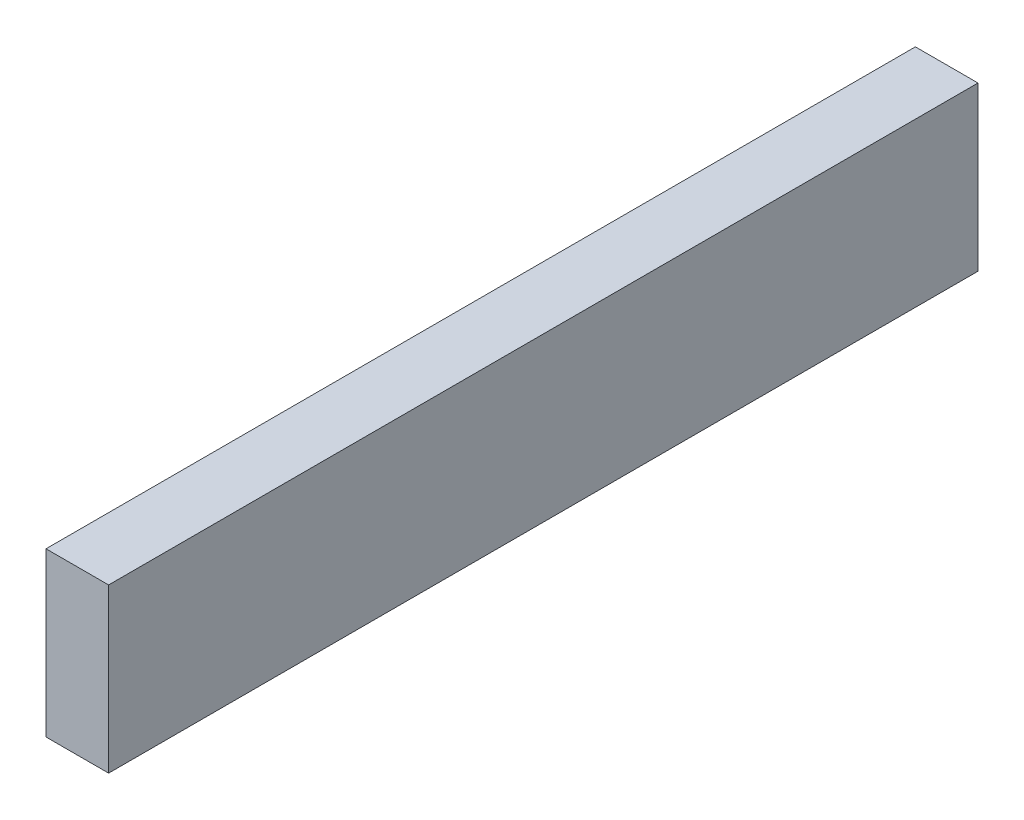
ISO-10303-21;
HEADER;
FILE_DESCRIPTION(('STEP AP214'),'2;1');
FILE_NAME('part.step','',(''),(''),'','','');
FILE_SCHEMA(('AUTOMOTIVE_DESIGN { 1 0 10303 214 1 1 1 1 }'));
ENDSEC;
DATA;
#1=APPLICATION_CONTEXT('core data for automotive mechanical design processes');
#2=APPLICATION_PROTOCOL_DEFINITION('international standard','automotive_design',2000,#1);
#3=PRODUCT_CONTEXT('',#1,'mechanical');
#4=PRODUCT('Part','Part','',(#3));
#5=PRODUCT_RELATED_PRODUCT_CATEGORY('part','',(#4));
#6=PRODUCT_DEFINITION_FORMATION('','',#4);
#7=PRODUCT_DEFINITION_CONTEXT('part definition',#1,'design');
#8=PRODUCT_DEFINITION('design','',#6,#7);
#9=PRODUCT_DEFINITION_SHAPE('','',#8);
#10=(LENGTH_UNIT() NAMED_UNIT(*) SI_UNIT(.MILLI.,.METRE.));
#11=(NAMED_UNIT(*) PLANE_ANGLE_UNIT() SI_UNIT($,.RADIAN.));
#12=(NAMED_UNIT(*) SI_UNIT($,.STERADIAN.) SOLID_ANGLE_UNIT());
#13=UNCERTAINTY_MEASURE_WITH_UNIT(LENGTH_MEASURE(1.E-05),#10,'distance_accuracy_value','');
#14=(GEOMETRIC_REPRESENTATION_CONTEXT(3) GLOBAL_UNCERTAINTY_ASSIGNED_CONTEXT((#13)) GLOBAL_UNIT_ASSIGNED_CONTEXT((#10,
#11,#12)) REPRESENTATION_CONTEXT('',''));
#15=CARTESIAN_POINT('',(0.,0.,0.));
#16=DIRECTION('',(0.,0.,1.));
#17=DIRECTION('',(1.,0.,0.));
#18=AXIS2_PLACEMENT_3D('',#15,#16,#17);
#19=CARTESIAN_POINT('',(7.31819608094262,-19.05,203.2));
#20=DIRECTION('',(-1.,0.,0.));
#21=DIRECTION('',(0.,0.,1.));
#22=AXIS2_PLACEMENT_3D('',#19,#20,#21);
#23=PLANE('',#22);
#24=DIRECTION('',(0.,1.,0.));
#25=VECTOR('',#24,1.);
#26=CARTESIAN_POINT('',(7.31819608094262,-19.05,0.));
#27=LINE('',#26,#25);
#28=CARTESIAN_POINT('',(7.31819608094262,-19.05,0.));
#29=VERTEX_POINT('',#28);
#30=CARTESIAN_POINT('',(7.31819608094262,19.05,0.));
#31=VERTEX_POINT('',#30);
#32=EDGE_CURVE('E127',#29,#31,#27,.T.);
#33=ORIENTED_EDGE('',*,*,#32,.T.);
#34=DIRECTION('',(0.,0.,-1.));
#35=VECTOR('',#34,1.);
#36=CARTESIAN_POINT('',(7.31819608094262,19.05,203.2));
#37=LINE('',#36,#35);
#38=CARTESIAN_POINT('',(7.31819608094262,19.05,203.2));
#39=VERTEX_POINT('',#38);
#40=EDGE_CURVE('E12',#39,#31,#37,.T.);
#41=ORIENTED_EDGE('',*,*,#40,.F.);
#42=DIRECTION('',(0.,1.,0.));
#43=VECTOR('',#42,1.);
#44=CARTESIAN_POINT('',(7.31819608094262,-19.05,203.2));
#45=LINE('',#44,#43);
#46=CARTESIAN_POINT('',(7.31819608094262,-19.05,203.2));
#47=VERTEX_POINT('',#46);
#48=EDGE_CURVE('E91',#47,#39,#45,.T.);
#49=ORIENTED_EDGE('',*,*,#48,.F.);
#50=DIRECTION('',(0.,0.,-1.));
#51=VECTOR('',#50,1.);
#52=CARTESIAN_POINT('',(7.31819608094262,-19.05,203.2));
#53=LINE('',#52,#51);
#54=EDGE_CURVE('E99',#47,#29,#53,.T.);
#55=ORIENTED_EDGE('',*,*,#54,.T.);
#56=EDGE_LOOP('',(#33,#41,#49,#55));
#57=FACE_BOUND('',#56,.T.);
#58=ADVANCED_FACE('F39',(#57),#23,.F.);
#59=CARTESIAN_POINT('',(-7.31819608094262,19.05,203.2));
#60=DIRECTION('',(0.,-1.,0.));
#61=DIRECTION('',(0.,0.,-1.));
#62=AXIS2_PLACEMENT_3D('',#59,#60,#61);
#63=PLANE('',#62);
#64=DIRECTION('',(-1.,0.,0.));
#65=VECTOR('',#64,1.);
#66=CARTESIAN_POINT('',(-7.31819608094262,19.05,0.));
#67=LINE('',#66,#65);
#68=CARTESIAN_POINT('',(-7.31819608094262,19.05,0.));
#69=VERTEX_POINT('',#68);
#70=EDGE_CURVE('E95',#31,#69,#67,.T.);
#71=ORIENTED_EDGE('',*,*,#70,.T.);
#72=DIRECTION('',(0.,0.,-1.));
#73=VECTOR('',#72,1.);
#74=CARTESIAN_POINT('',(-7.31819608094262,19.05,203.2));
#75=LINE('',#74,#73);
#76=CARTESIAN_POINT('',(-7.31819608094262,19.05,203.2));
#77=VERTEX_POINT('',#76);
#78=EDGE_CURVE('E48',#77,#69,#75,.T.);
#79=ORIENTED_EDGE('',*,*,#78,.F.);
#80=DIRECTION('',(-1.,0.,0.));
#81=VECTOR('',#80,1.);
#82=CARTESIAN_POINT('',(-7.31819608094262,19.05,203.2));
#83=LINE('',#82,#81);
#84=EDGE_CURVE('E86',#39,#77,#83,.T.);
#85=ORIENTED_EDGE('',*,*,#84,.F.);
#86=ORIENTED_EDGE('',*,*,#40,.T.);
#87=EDGE_LOOP('',(#71,#79,#85,#86));
#88=FACE_BOUND('',#87,.T.);
#89=ADVANCED_FACE('F94',(#88),#63,.F.);
#90=CARTESIAN_POINT('',(-7.31819608094262,-19.05,203.2));
#91=DIRECTION('',(1.,0.,0.));
#92=DIRECTION('',(0.,0.,-1.));
#93=AXIS2_PLACEMENT_3D('',#90,#91,#92);
#94=PLANE('',#93);
#95=DIRECTION('',(0.,-1.,0.));
#96=VECTOR('',#95,1.);
#97=CARTESIAN_POINT('',(-7.31819608094262,-19.05,0.));
#98=LINE('',#97,#96);
#99=CARTESIAN_POINT('',(-7.31819608094262,-19.05,0.));
#100=VERTEX_POINT('',#99);
#101=EDGE_CURVE('E73',#69,#100,#98,.T.);
#102=ORIENTED_EDGE('',*,*,#101,.T.);
#103=DIRECTION('',(0.,0.,-1.));
#104=VECTOR('',#103,1.);
#105=CARTESIAN_POINT('',(-7.31819608094262,-19.05,203.2));
#106=LINE('',#105,#104);
#107=CARTESIAN_POINT('',(-7.31819608094262,-19.05,203.2));
#108=VERTEX_POINT('',#107);
#109=EDGE_CURVE('E96',#108,#100,#106,.T.);
#110=ORIENTED_EDGE('',*,*,#109,.F.);
#111=DIRECTION('',(0.,-1.,0.));
#112=VECTOR('',#111,1.);
#113=CARTESIAN_POINT('',(-7.31819608094262,-19.05,203.2));
#114=LINE('',#113,#112);
#115=EDGE_CURVE('E89',#77,#108,#114,.T.);
#116=ORIENTED_EDGE('',*,*,#115,.F.);
#117=ORIENTED_EDGE('',*,*,#78,.T.);
#118=EDGE_LOOP('',(#102,#110,#116,#117));
#119=FACE_BOUND('',#118,.T.);
#120=ADVANCED_FACE('F97',(#119),#94,.F.);
#121=CARTESIAN_POINT('',(-7.31819608094262,-19.05,203.2));
#122=DIRECTION('',(0.,1.,0.));
#123=DIRECTION('',(0.,0.,1.));
#124=AXIS2_PLACEMENT_3D('',#121,#122,#123);
#125=PLANE('',#124);
#126=DIRECTION('',(1.,0.,0.));
#127=VECTOR('',#126,1.);
#128=CARTESIAN_POINT('',(-7.31819608094262,-19.05,0.));
#129=LINE('',#128,#127);
#130=EDGE_CURVE('E79',#100,#29,#129,.T.);
#131=ORIENTED_EDGE('',*,*,#130,.T.);
#132=ORIENTED_EDGE('',*,*,#54,.F.);
#133=DIRECTION('',(1.,0.,0.));
#134=VECTOR('',#133,1.);
#135=CARTESIAN_POINT('',(-7.31819608094262,-19.05,203.2));
#136=LINE('',#135,#134);
#137=EDGE_CURVE('E56',#108,#47,#136,.T.);
#138=ORIENTED_EDGE('',*,*,#137,.F.);
#139=ORIENTED_EDGE('',*,*,#109,.T.);
#140=EDGE_LOOP('',(#131,#132,#138,#139));
#141=FACE_BOUND('',#140,.T.);
#142=ADVANCED_FACE('F139',(#141),#125,.F.);
#143=CARTESIAN_POINT('',(0.,0.,203.2));
#144=DIRECTION('',(0.,0.,-1.));
#145=DIRECTION('',(-1.,0.,0.));
#146=AXIS2_PLACEMENT_3D('',#143,#144,#145);
#147=PLANE('',#146);
#148=ORIENTED_EDGE('',*,*,#48,.T.);
#149=ORIENTED_EDGE('',*,*,#84,.T.);
#150=ORIENTED_EDGE('',*,*,#115,.T.);
#151=ORIENTED_EDGE('',*,*,#137,.T.);
#152=EDGE_LOOP('',(#148,#149,#150,#151));
#153=FACE_BOUND('',#152,.T.);
#154=ADVANCED_FACE('F87',(#153),#147,.F.);
#155=CARTESIAN_POINT('',(0.,0.,0.));
#156=DIRECTION('',(0.,0.,-1.));
#157=DIRECTION('',(-1.,0.,0.));
#158=AXIS2_PLACEMENT_3D('',#155,#156,#157);
#159=PLANE('',#158);
#160=ORIENTED_EDGE('',*,*,#32,.F.);
#161=ORIENTED_EDGE('',*,*,#130,.F.);
#162=ORIENTED_EDGE('',*,*,#101,.F.);
#163=ORIENTED_EDGE('',*,*,#70,.F.);
#164=EDGE_LOOP('',(#160,#161,#162,#163));
#165=FACE_BOUND('',#164,.T.);
#166=ADVANCED_FACE('F133',(#165),#159,.T.);
#167=CLOSED_SHELL('',(#58,#89,#120,#142,#154,#166));
#168=MANIFOLD_SOLID_BREP('B2',#167);
#169=ADVANCED_BREP_SHAPE_REPRESENTATION('',(#18,#168),#14);
#170=SHAPE_DEFINITION_REPRESENTATION(#9,#169);
ENDSEC;
END-ISO-10303-21;
